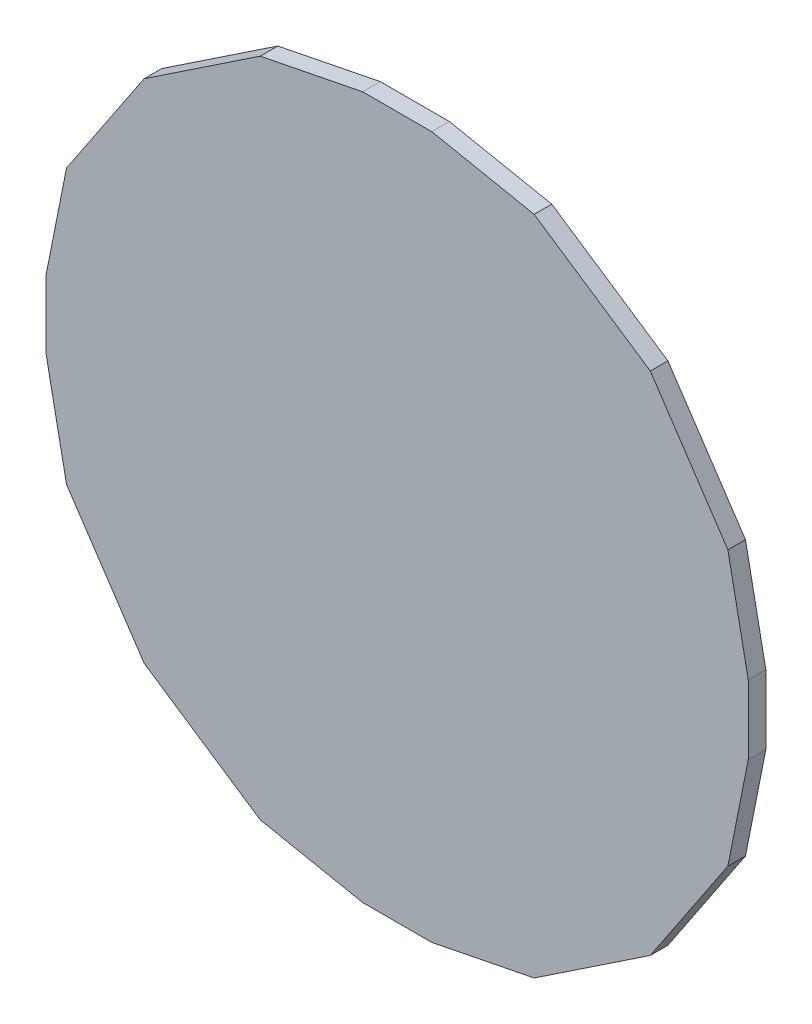
ISO-10303-21;
HEADER;
FILE_DESCRIPTION(('STEP AP214'),'2;1');
FILE_NAME('part.step','',(''),(''),'','','');
FILE_SCHEMA(('AUTOMOTIVE_DESIGN { 1 0 10303 214 1 1 1 1 }'));
ENDSEC;
DATA;
#1=APPLICATION_CONTEXT('core data for automotive mechanical design processes');
#2=APPLICATION_PROTOCOL_DEFINITION('international standard','automotive_design',2000,#1);
#3=PRODUCT_CONTEXT('',#1,'mechanical');
#4=PRODUCT('Part','Part','',(#3));
#5=PRODUCT_RELATED_PRODUCT_CATEGORY('part','',(#4));
#6=PRODUCT_DEFINITION_FORMATION('','',#4);
#7=PRODUCT_DEFINITION_CONTEXT('part definition',#1,'design');
#8=PRODUCT_DEFINITION('design','',#6,#7);
#9=PRODUCT_DEFINITION_SHAPE('','',#8);
#10=(LENGTH_UNIT() NAMED_UNIT(*) SI_UNIT(.MILLI.,.METRE.));
#11=(NAMED_UNIT(*) PLANE_ANGLE_UNIT() SI_UNIT($,.RADIAN.));
#12=(NAMED_UNIT(*) SI_UNIT($,.STERADIAN.) SOLID_ANGLE_UNIT());
#13=UNCERTAINTY_MEASURE_WITH_UNIT(LENGTH_MEASURE(1.E-05),#10,'distance_accuracy_value','');
#14=(GEOMETRIC_REPRESENTATION_CONTEXT(3) GLOBAL_UNCERTAINTY_ASSIGNED_CONTEXT((#13)) GLOBAL_UNIT_ASSIGNED_CONTEXT((#10,
#11,#12)) REPRESENTATION_CONTEXT('',''));
#15=CARTESIAN_POINT('',(0.,0.,0.));
#16=DIRECTION('',(0.,0.,1.));
#17=DIRECTION('',(1.,0.,0.));
#18=AXIS2_PLACEMENT_3D('',#15,#16,#17);
#19=CARTESIAN_POINT('',(-0.1994916,0.,0.00999998));
#20=DIRECTION('',(0.,0.,-1.));
#21=DIRECTION('',(-1.,0.,0.));
#22=AXIS2_PLACEMENT_3D('',#19,#20,#21);
#23=PLANE('',#22);
#24=DIRECTION('',(-0.195095122920935,0.980784325431675,0.));
#25=VECTOR('',#24,1.);
#26=CARTESIAN_POINT('',(-0.1994916,-0.01964943999999,0.00999998));
#27=LINE('',#26,#25);
#28=CARTESIAN_POINT('',(-0.1994916,-0.0196494399999899,0.00999998));
#29=VERTEX_POINT('',#28);
#30=CARTESIAN_POINT('',(-0.187916819999997,-0.0778382999999995,0.00999998));
#31=VERTEX_POINT('',#30);
#32=EDGE_CURVE('E239',#29,#31,#27,.F.);
#33=ORIENTED_EDGE('',*,*,#32,.T.);
#34=DIRECTION('',(-0.5555787996273,0.831463888214448,0.));
#35=VECTOR('',#34,1.);
#36=CARTESIAN_POINT('',(-0.18791682,-0.0778383,0.00999998));
#37=LINE('',#36,#35);
#38=CARTESIAN_POINT('',(-0.143824959999998,-0.143824959999999,0.00999998));
#39=VERTEX_POINT('',#38);
#40=EDGE_CURVE('E235',#31,#39,#37,.F.);
#41=ORIENTED_EDGE('',*,*,#40,.T.);
#42=DIRECTION('',(-0.831463888214757,0.555578799626838,0.));
#43=VECTOR('',#42,1.);
#44=CARTESIAN_POINT('',(-0.14382496,-0.14382496,0.00999998));
#45=LINE('',#44,#43);
#46=CARTESIAN_POINT('',(-0.0778382999999949,-0.187916819999992,0.00999998));
#47=VERTEX_POINT('',#46);
#48=EDGE_CURVE('E231',#39,#47,#45,.F.);
#49=ORIENTED_EDGE('',*,*,#48,.T.);
#50=DIRECTION('',(-0.980784325431675,0.195095122920935,0.));
#51=VECTOR('',#50,1.);
#52=CARTESIAN_POINT('',(-0.0778383,-0.18791682,0.00999998));
#53=LINE('',#52,#51);
#54=CARTESIAN_POINT('',(-0.0196494399999902,-0.199491600000003,0.00999998));
#55=VERTEX_POINT('',#54);
#56=EDGE_CURVE('E226',#47,#55,#53,.F.);
#57=ORIENTED_EDGE('',*,*,#56,.T.);
#58=DIRECTION('',(1.,0.,0.));
#59=VECTOR('',#58,1.);
#60=CARTESIAN_POINT('',(-0.01964943999999,-0.1994916,0.00999998));
#61=LINE('',#60,#59);
#62=CARTESIAN_POINT('',(0.0196494400000197,-0.1994916,0.00999998));
#63=VERTEX_POINT('',#62);
#64=EDGE_CURVE('E224',#55,#63,#61,.T.);
#65=ORIENTED_EDGE('',*,*,#64,.T.);
#66=DIRECTION('',(-0.980784325431675,-0.195095122920935,0.));
#67=VECTOR('',#66,1.);
#68=CARTESIAN_POINT('',(0.01964944000002,-0.1994916,0.00999998));
#69=LINE('',#68,#67);
#70=CARTESIAN_POINT('',(0.0778382999999997,-0.187916819999999,0.00999998));
#71=VERTEX_POINT('',#70);
#72=EDGE_CURVE('E218',#63,#71,#69,.F.);
#73=ORIENTED_EDGE('',*,*,#72,.T.);
#74=DIRECTION('',(-0.831463888214757,-0.555578799626838,0.));
#75=VECTOR('',#74,1.);
#76=CARTESIAN_POINT('',(0.0778383,-0.18791682,0.00999998));
#77=LINE('',#76,#75);
#78=CARTESIAN_POINT('',(0.143824960000005,-0.143824960000008,0.00999998));
#79=VERTEX_POINT('',#78);
#80=EDGE_CURVE('E214',#71,#79,#77,.F.);
#81=ORIENTED_EDGE('',*,*,#80,.T.);
#82=DIRECTION('',(-0.555578799626838,-0.831463888214757,0.));
#83=VECTOR('',#82,1.);
#84=CARTESIAN_POINT('',(0.14382496,-0.14382496,0.00999998));
#85=LINE('',#84,#83);
#86=CARTESIAN_POINT('',(0.187916819999992,-0.0778382999999949,0.00999998));
#87=VERTEX_POINT('',#86);
#88=EDGE_CURVE('E210',#79,#87,#85,.F.);
#89=ORIENTED_EDGE('',*,*,#88,.T.);
#90=DIRECTION('',(-0.195095122920935,-0.980784325431675,0.));
#91=VECTOR('',#90,1.);
#92=CARTESIAN_POINT('',(0.18791682,-0.0778383,0.00999998));
#93=LINE('',#92,#91);
#94=CARTESIAN_POINT('',(0.199491600000003,-0.0196494399999906,0.00999998));
#95=VERTEX_POINT('',#94);
#96=EDGE_CURVE('E205',#87,#95,#93,.F.);
#97=ORIENTED_EDGE('',*,*,#96,.T.);
#98=DIRECTION('',(0.,1.,0.));
#99=VECTOR('',#98,1.);
#100=CARTESIAN_POINT('',(0.1994916,-0.01964943999999,0.00999998));
#101=LINE('',#100,#99);
#102=CARTESIAN_POINT('',(0.1994916,0.01964943999999,0.00999998));
#103=VERTEX_POINT('',#102);
#104=EDGE_CURVE('E203',#95,#103,#101,.T.);
#105=ORIENTED_EDGE('',*,*,#104,.T.);
#106=DIRECTION('',(0.195095122920935,-0.980784325431675,0.));
#107=VECTOR('',#106,1.);
#108=CARTESIAN_POINT('',(0.1994916,0.01964943999999,0.00999998));
#109=LINE('',#108,#107);
#110=CARTESIAN_POINT('',(0.187916819999997,0.0778382999999994,0.00999998));
#111=VERTEX_POINT('',#110);
#112=EDGE_CURVE('E197',#103,#111,#109,.F.);
#113=ORIENTED_EDGE('',*,*,#112,.T.);
#114=DIRECTION('',(0.555578799626838,-0.831463888214757,0.));
#115=VECTOR('',#114,1.);
#116=CARTESIAN_POINT('',(0.18791682,0.0778383,0.00999998));
#117=LINE('',#116,#115);
#118=CARTESIAN_POINT('',(0.143824960000008,0.143824960000005,0.00999998));
#119=VERTEX_POINT('',#118);
#120=EDGE_CURVE('E193',#111,#119,#117,.F.);
#121=ORIENTED_EDGE('',*,*,#120,.T.);
#122=DIRECTION('',(0.831463888214757,-0.555578799626838,0.));
#123=VECTOR('',#122,1.);
#124=CARTESIAN_POINT('',(0.14382496,0.14382496,0.00999998));
#125=LINE('',#124,#123);
#126=CARTESIAN_POINT('',(0.0778382999999949,0.187916819999992,0.00999998));
#127=VERTEX_POINT('',#126);
#128=EDGE_CURVE('E189',#119,#127,#125,.F.);
#129=ORIENTED_EDGE('',*,*,#128,.T.);
#130=DIRECTION('',(0.980784325431675,-0.195095122920935,0.));
#131=VECTOR('',#130,1.);
#132=CARTESIAN_POINT('',(0.0778383,0.18791682,0.00999998));
#133=LINE('',#132,#131);
#134=CARTESIAN_POINT('',(0.0196494400000201,0.199491600000001,0.00999998));
#135=VERTEX_POINT('',#134);
#136=EDGE_CURVE('E184',#127,#135,#133,.F.);
#137=ORIENTED_EDGE('',*,*,#136,.T.);
#138=DIRECTION('',(1.,0.,0.));
#139=VECTOR('',#138,1.);
#140=CARTESIAN_POINT('',(0.01964944000002,0.1994916,0.00999998));
#141=LINE('',#140,#139);
#142=CARTESIAN_POINT('',(-0.0196494399999899,0.1994916,0.00999998));
#143=VERTEX_POINT('',#142);
#144=EDGE_CURVE('E182',#135,#143,#141,.F.);
#145=ORIENTED_EDGE('',*,*,#144,.T.);
#146=DIRECTION('',(0.980784325431675,0.195095122920935,0.));
#147=VECTOR('',#146,1.);
#148=CARTESIAN_POINT('',(-0.01964943999999,0.1994916,0.00999998));
#149=LINE('',#148,#147);
#150=CARTESIAN_POINT('',(-0.0778382999999995,0.187916819999997,0.00999998));
#151=VERTEX_POINT('',#150);
#152=EDGE_CURVE('E176',#143,#151,#149,.F.);
#153=ORIENTED_EDGE('',*,*,#152,.T.);
#154=DIRECTION('',(0.831463888214757,0.555578799626838,0.));
#155=VECTOR('',#154,1.);
#156=CARTESIAN_POINT('',(-0.0778383,0.18791682,0.00999998));
#157=LINE('',#156,#155);
#158=CARTESIAN_POINT('',(-0.143824960000005,0.143824960000008,0.00999998));
#159=VERTEX_POINT('',#158);
#160=EDGE_CURVE('E172',#151,#159,#157,.F.);
#161=ORIENTED_EDGE('',*,*,#160,.T.);
#162=DIRECTION('',(0.5555787996273,0.831463888214448,0.));
#163=VECTOR('',#162,1.);
#164=CARTESIAN_POINT('',(-0.14382496,0.14382496,0.00999998));
#165=LINE('',#164,#163);
#166=CARTESIAN_POINT('',(-0.187916820000002,0.077838300000001,0.00999998));
#167=VERTEX_POINT('',#166);
#168=EDGE_CURVE('E151',#159,#167,#165,.F.);
#169=ORIENTED_EDGE('',*,*,#168,.T.);
#170=DIRECTION('',(0.195095122920935,0.980784325431675,0.));
#171=VECTOR('',#170,1.);
#172=CARTESIAN_POINT('',(-0.18791682,0.0778383,0.00999998));
#173=LINE('',#172,#171);
#174=CARTESIAN_POINT('',(-0.199491600000003,0.0196494399999905,0.00999998));
#175=VERTEX_POINT('',#174);
#176=EDGE_CURVE('E20',#167,#175,#173,.F.);
#177=ORIENTED_EDGE('',*,*,#176,.T.);
#178=DIRECTION('',(0.,1.,0.));
#179=VECTOR('',#178,1.);
#180=CARTESIAN_POINT('',(-0.1994916,0.,0.00999998));
#181=LINE('',#180,#179);
#182=EDGE_CURVE('E154',#175,#29,#181,.F.);
#183=ORIENTED_EDGE('',*,*,#182,.T.);
#184=EDGE_LOOP('',(#33,#41,#49,#57,#65,#73,#81,#89,#97,#105,#113,#121,#129,#137,#145,#153,#161,
#169,#177,#183));
#185=FACE_BOUND('',#184,.T.);
#186=ADVANCED_FACE('F17',(#185),#23,.F.);
#187=CARTESIAN_POINT('',(-0.18791682,0.0778383,0.));
#188=DIRECTION('',(0.980784325431675,-0.195095122920935,0.));
#189=DIRECTION('',(0.195095122920935,0.980784325431675,0.));
#190=AXIS2_PLACEMENT_3D('',#187,#188,#189);
#191=PLANE('',#190);
#192=DIRECTION('',(0.,0.,1.));
#193=VECTOR('',#192,1.);
#194=CARTESIAN_POINT('',(-0.199491600000011,0.0196494399999922,0.));
#195=LINE('',#194,#193);
#196=CARTESIAN_POINT('',(-0.199491600000003,0.0196494399999905,0.));
#197=VERTEX_POINT('',#196);
#198=EDGE_CURVE('E157',#175,#197,#195,.F.);
#199=ORIENTED_EDGE('',*,*,#198,.F.);
#200=ORIENTED_EDGE('',*,*,#176,.F.);
#201=DIRECTION('',(0.,0.,1.));
#202=VECTOR('',#201,1.);
#203=CARTESIAN_POINT('',(-0.187916820000006,0.0778383000000042,0.));
#204=LINE('',#203,#202);
#205=CARTESIAN_POINT('',(-0.187916820000002,0.077838300000001,0.));
#206=VERTEX_POINT('',#205);
#207=EDGE_CURVE('E168',#167,#206,#204,.F.);
#208=ORIENTED_EDGE('',*,*,#207,.T.);
#209=DIRECTION('',(0.195095122920753,0.980784325431711,0.));
#210=VECTOR('',#209,1.);
#211=CARTESIAN_POINT('',(-0.1994916,0.01964943999999,0.));
#212=LINE('',#211,#210);
#213=EDGE_CURVE('E167',#197,#206,#212,.T.);
#214=ORIENTED_EDGE('',*,*,#213,.F.);
#215=EDGE_LOOP('',(#199,#200,#208,#214));
#216=FACE_BOUND('',#215,.T.);
#217=ADVANCED_FACE('F165',(#216),#191,.F.);
#218=CARTESIAN_POINT('',(-0.14382496,0.14382496,0.));
#219=DIRECTION('',(0.831463888214448,-0.5555787996273,0.));
#220=DIRECTION('',(0.5555787996273,0.831463888214448,0.));
#221=AXIS2_PLACEMENT_3D('',#218,#219,#220);
#222=PLANE('',#221);
#223=ORIENTED_EDGE('',*,*,#207,.F.);
#224=ORIENTED_EDGE('',*,*,#168,.F.);
#225=DIRECTION('',(0.,0.,1.));
#226=VECTOR('',#225,1.);
#227=CARTESIAN_POINT('',(-0.14382496000002,0.14382496000003,0.));
#228=LINE('',#227,#226);
#229=CARTESIAN_POINT('',(-0.143824960000005,0.143824960000008,0.));
#230=VERTEX_POINT('',#229);
#231=EDGE_CURVE('E174',#159,#230,#228,.F.);
#232=ORIENTED_EDGE('',*,*,#231,.T.);
#233=DIRECTION('',(0.55557879962722,0.831463888214502,0.));
#234=VECTOR('',#233,1.);
#235=CARTESIAN_POINT('',(-0.18791682,0.0778383,0.));
#236=LINE('',#235,#234);
#237=EDGE_CURVE('E245',#206,#230,#236,.T.);
#238=ORIENTED_EDGE('',*,*,#237,.F.);
#239=EDGE_LOOP('',(#223,#224,#232,#238));
#240=FACE_BOUND('',#239,.T.);
#241=ADVANCED_FACE('F379',(#240),#222,.F.);
#242=CARTESIAN_POINT('',(-0.0778383,0.18791682,0.));
#243=DIRECTION('',(0.555578799626838,-0.831463888214757,0.));
#244=DIRECTION('',(0.831463888214757,0.555578799626838,0.));
#245=AXIS2_PLACEMENT_3D('',#242,#243,#244);
#246=PLANE('',#245);
#247=ORIENTED_EDGE('',*,*,#231,.F.);
#248=ORIENTED_EDGE('',*,*,#160,.F.);
#249=DIRECTION('',(0.,0.,1.));
#250=VECTOR('',#249,1.);
#251=CARTESIAN_POINT('',(-0.0778382999999978,0.187916819999989,0.));
#252=LINE('',#251,#250);
#253=CARTESIAN_POINT('',(-0.0778382999999995,0.187916819999997,0.));
#254=VERTEX_POINT('',#253);
#255=EDGE_CURVE('E178',#151,#254,#252,.F.);
#256=ORIENTED_EDGE('',*,*,#255,.T.);
#257=DIRECTION('',(0.831463888214502,0.55557879962722,0.));
#258=VECTOR('',#257,1.);
#259=CARTESIAN_POINT('',(-0.14382496,0.14382496,0.));
#260=LINE('',#259,#258);
#261=EDGE_CURVE('E248',#230,#254,#260,.T.);
#262=ORIENTED_EDGE('',*,*,#261,.F.);
#263=EDGE_LOOP('',(#247,#248,#256,#262));
#264=FACE_BOUND('',#263,.T.);
#265=ADVANCED_FACE('F375',(#264),#246,.F.);
#266=CARTESIAN_POINT('',(-0.01964943999999,0.1994916,0.));
#267=DIRECTION('',(0.195095122920935,-0.980784325431675,0.));
#268=DIRECTION('',(0.980784325431675,0.195095122920935,0.));
#269=AXIS2_PLACEMENT_3D('',#266,#267,#268);
#270=PLANE('',#269);
#271=ORIENTED_EDGE('',*,*,#255,.F.);
#272=ORIENTED_EDGE('',*,*,#152,.F.);
#273=DIRECTION('',(0.,0.,-1.));
#274=VECTOR('',#273,1.);
#275=CARTESIAN_POINT('',(-0.01964943999999,0.1994916,0.));
#276=LINE('',#275,#274);
#277=CARTESIAN_POINT('',(-0.01964943999999,0.1994916,0.));
#278=VERTEX_POINT('',#277);
#279=EDGE_CURVE('E180',#143,#278,#276,.T.);
#280=ORIENTED_EDGE('',*,*,#279,.T.);
#281=DIRECTION('',(0.980784325431711,0.195095122920753,0.));
#282=VECTOR('',#281,1.);
#283=CARTESIAN_POINT('',(-0.0778383,0.18791682,0.));
#284=LINE('',#283,#282);
#285=EDGE_CURVE('E251',#254,#278,#284,.T.);
#286=ORIENTED_EDGE('',*,*,#285,.F.);
#287=EDGE_LOOP('',(#271,#272,#280,#286));
#288=FACE_BOUND('',#287,.T.);
#289=ADVANCED_FACE('F371',(#288),#270,.F.);
#290=CARTESIAN_POINT('',(0.01964944000002,0.1994916,0.));
#291=DIRECTION('',(0.,-1.,0.));
#292=DIRECTION('',(0.,0.,-1.));
#293=AXIS2_PLACEMENT_3D('',#290,#291,#292);
#294=PLANE('',#293);
#295=DIRECTION('',(0.,0.,1.));
#296=VECTOR('',#295,1.);
#297=CARTESIAN_POINT('',(0.019649440000021,0.199491600000005,0.));
#298=LINE('',#297,#296);
#299=CARTESIAN_POINT('',(0.0196494400000202,0.199491600000001,0.));
#300=VERTEX_POINT('',#299);
#301=EDGE_CURVE('E186',#135,#300,#298,.F.);
#302=ORIENTED_EDGE('',*,*,#301,.T.);
#303=DIRECTION('',(-1.,0.,0.));
#304=VECTOR('',#303,1.);
#305=CARTESIAN_POINT('',(-0.1994916,0.1994916,0.));
#306=LINE('',#305,#304);
#307=EDGE_CURVE('E254',#278,#300,#306,.F.);
#308=ORIENTED_EDGE('',*,*,#307,.F.);
#309=ORIENTED_EDGE('',*,*,#279,.F.);
#310=ORIENTED_EDGE('',*,*,#144,.F.);
#311=EDGE_LOOP('',(#302,#308,#309,#310));
#312=FACE_BOUND('',#311,.T.);
#313=ADVANCED_FACE('F366',(#312),#294,.F.);
#314=CARTESIAN_POINT('',(0.0778383,0.18791682,0.));
#315=DIRECTION('',(-0.195095122920935,-0.980784325431675,0.));
#316=DIRECTION('',(0.980784325431675,-0.195095122920935,0.));
#317=AXIS2_PLACEMENT_3D('',#314,#315,#316);
#318=PLANE('',#317);
#319=ORIENTED_EDGE('',*,*,#301,.F.);
#320=ORIENTED_EDGE('',*,*,#136,.F.);
#321=DIRECTION('',(0.,0.,1.));
#322=VECTOR('',#321,1.);
#323=CARTESIAN_POINT('',(0.0778382999999797,0.18791681999997,0.));
#324=LINE('',#323,#322);
#325=CARTESIAN_POINT('',(0.0778382999999949,0.187916819999992,0.));
#326=VERTEX_POINT('',#325);
#327=EDGE_CURVE('E191',#127,#326,#324,.F.);
#328=ORIENTED_EDGE('',*,*,#327,.T.);
#329=DIRECTION('',(0.980784325431692,-0.19509512292085,0.));
#330=VECTOR('',#329,1.);
#331=CARTESIAN_POINT('',(0.01964944000002,0.1994916,0.));
#332=LINE('',#331,#330);
#333=EDGE_CURVE('E256',#300,#326,#332,.T.);
#334=ORIENTED_EDGE('',*,*,#333,.F.);
#335=EDGE_LOOP('',(#319,#320,#328,#334));
#336=FACE_BOUND('',#335,.T.);
#337=ADVANCED_FACE('F361',(#336),#318,.F.);
#338=CARTESIAN_POINT('',(0.14382496,0.14382496,0.));
#339=DIRECTION('',(-0.555578799626838,-0.831463888214757,0.));
#340=DIRECTION('',(0.831463888214757,-0.555578799626838,0.));
#341=AXIS2_PLACEMENT_3D('',#338,#339,#340);
#342=PLANE('',#341);
#343=ORIENTED_EDGE('',*,*,#327,.F.);
#344=ORIENTED_EDGE('',*,*,#128,.F.);
#345=DIRECTION('',(0.,0.,1.));
#346=VECTOR('',#345,1.);
#347=CARTESIAN_POINT('',(0.14382496000003,0.14382496000002,0.));
#348=LINE('',#347,#346);
#349=CARTESIAN_POINT('',(0.143824960000008,0.143824960000005,0.));
#350=VERTEX_POINT('',#349);
#351=EDGE_CURVE('E195',#119,#350,#348,.F.);
#352=ORIENTED_EDGE('',*,*,#351,.T.);
#353=DIRECTION('',(0.831463888214502,-0.55557879962722,0.));
#354=VECTOR('',#353,1.);
#355=CARTESIAN_POINT('',(0.0778383,0.18791682,0.));
#356=LINE('',#355,#354);
#357=EDGE_CURVE('E259',#326,#350,#356,.T.);
#358=ORIENTED_EDGE('',*,*,#357,.F.);
#359=EDGE_LOOP('',(#343,#344,#352,#358));
#360=FACE_BOUND('',#359,.T.);
#361=ADVANCED_FACE('F356',(#360),#342,.F.);
#362=CARTESIAN_POINT('',(0.18791682,0.0778383,0.));
#363=DIRECTION('',(-0.831463888214757,-0.555578799626838,0.));
#364=DIRECTION('',(0.555578799626838,-0.831463888214757,0.));
#365=AXIS2_PLACEMENT_3D('',#362,#363,#364);
#366=PLANE('',#365);
#367=ORIENTED_EDGE('',*,*,#351,.F.);
#368=ORIENTED_EDGE('',*,*,#120,.F.);
#369=DIRECTION('',(0.,0.,1.));
#370=VECTOR('',#369,1.);
#371=CARTESIAN_POINT('',(0.187916819999989,0.0778382999999978,0.));
#372=LINE('',#371,#370);
#373=CARTESIAN_POINT('',(0.187916819999997,0.0778382999999994,0.));
#374=VERTEX_POINT('',#373);
#375=EDGE_CURVE('E199',#111,#374,#372,.F.);
#376=ORIENTED_EDGE('',*,*,#375,.T.);
#377=DIRECTION('',(0.55557879962722,-0.831463888214502,0.));
#378=VECTOR('',#377,1.);
#379=CARTESIAN_POINT('',(0.14382496,0.14382496,0.));
#380=LINE('',#379,#378);
#381=EDGE_CURVE('E262',#350,#374,#380,.T.);
#382=ORIENTED_EDGE('',*,*,#381,.F.);
#383=EDGE_LOOP('',(#367,#368,#376,#382));
#384=FACE_BOUND('',#383,.T.);
#385=ADVANCED_FACE('F351',(#384),#366,.F.);
#386=CARTESIAN_POINT('',(0.1994916,0.01964943999999,0.));
#387=DIRECTION('',(-0.980784325431675,-0.195095122920935,0.));
#388=DIRECTION('',(0.195095122920935,-0.980784325431675,0.));
#389=AXIS2_PLACEMENT_3D('',#386,#387,#388);
#390=PLANE('',#389);
#391=ORIENTED_EDGE('',*,*,#375,.F.);
#392=ORIENTED_EDGE('',*,*,#112,.F.);
#393=DIRECTION('',(0.,0.,1.));
#394=VECTOR('',#393,1.);
#395=CARTESIAN_POINT('',(0.1994916,0.01964943999999,0.));
#396=LINE('',#395,#394);
#397=CARTESIAN_POINT('',(0.1994916,0.01964943999999,0.));
#398=VERTEX_POINT('',#397);
#399=EDGE_CURVE('E201',#103,#398,#396,.F.);
#400=ORIENTED_EDGE('',*,*,#399,.T.);
#401=DIRECTION('',(0.195095122920753,-0.980784325431711,0.));
#402=VECTOR('',#401,1.);
#403=CARTESIAN_POINT('',(0.18791682,0.0778383,0.));
#404=LINE('',#403,#402);
#405=EDGE_CURVE('E265',#374,#398,#404,.T.);
#406=ORIENTED_EDGE('',*,*,#405,.F.);
#407=EDGE_LOOP('',(#391,#392,#400,#406));
#408=FACE_BOUND('',#407,.T.);
#409=ADVANCED_FACE('F346',(#408),#390,.F.);
#410=CARTESIAN_POINT('',(0.1994916,-0.01964943999999,0.));
#411=DIRECTION('',(-1.,0.,0.));
#412=DIRECTION('',(0.,0.,1.));
#413=AXIS2_PLACEMENT_3D('',#410,#411,#412);
#414=PLANE('',#413);
#415=DIRECTION('',(0.,0.,1.));
#416=VECTOR('',#415,1.);
#417=CARTESIAN_POINT('',(0.199491600000011,-0.0196494399999922,0.));
#418=LINE('',#417,#416);
#419=CARTESIAN_POINT('',(0.199491600000003,-0.0196494399999906,0.));
#420=VERTEX_POINT('',#419);
#421=EDGE_CURVE('E207',#95,#420,#418,.F.);
#422=ORIENTED_EDGE('',*,*,#421,.T.);
#423=DIRECTION('',(0.,1.,0.));
#424=VECTOR('',#423,1.);
#425=CARTESIAN_POINT('',(0.1994916,0.,0.));
#426=LINE('',#425,#424);
#427=EDGE_CURVE('E268',#398,#420,#426,.F.);
#428=ORIENTED_EDGE('',*,*,#427,.F.);
#429=ORIENTED_EDGE('',*,*,#399,.F.);
#430=ORIENTED_EDGE('',*,*,#104,.F.);
#431=EDGE_LOOP('',(#422,#428,#429,#430));
#432=FACE_BOUND('',#431,.T.);
#433=ADVANCED_FACE('F340',(#432),#414,.F.);
#434=CARTESIAN_POINT('',(0.18791682,-0.0778383,0.));
#435=DIRECTION('',(-0.980784325431675,0.195095122920935,0.));
#436=DIRECTION('',(-0.195095122920935,-0.980784325431675,0.));
#437=AXIS2_PLACEMENT_3D('',#434,#435,#436);
#438=PLANE('',#437);
#439=ORIENTED_EDGE('',*,*,#421,.F.);
#440=ORIENTED_EDGE('',*,*,#96,.F.);
#441=DIRECTION('',(0.,0.,1.));
#442=VECTOR('',#441,1.);
#443=CARTESIAN_POINT('',(0.18791681999997,-0.0778382999999797,0.));
#444=LINE('',#443,#442);
#445=CARTESIAN_POINT('',(0.187916819999992,-0.0778382999999949,0.));
#446=VERTEX_POINT('',#445);
#447=EDGE_CURVE('E212',#87,#446,#444,.F.);
#448=ORIENTED_EDGE('',*,*,#447,.T.);
#449=DIRECTION('',(-0.195095122920753,-0.980784325431711,0.));
#450=VECTOR('',#449,1.);
#451=CARTESIAN_POINT('',(0.1994916,-0.01964943999999,0.));
#452=LINE('',#451,#450);
#453=EDGE_CURVE('E270',#420,#446,#452,.T.);
#454=ORIENTED_EDGE('',*,*,#453,.F.);
#455=EDGE_LOOP('',(#439,#440,#448,#454));
#456=FACE_BOUND('',#455,.T.);
#457=ADVANCED_FACE('F336',(#456),#438,.F.);
#458=CARTESIAN_POINT('',(0.14382496,-0.14382496,0.));
#459=DIRECTION('',(-0.831463888214757,0.555578799626838,0.));
#460=DIRECTION('',(-0.555578799626838,-0.831463888214757,0.));
#461=AXIS2_PLACEMENT_3D('',#458,#459,#460);
#462=PLANE('',#461);
#463=ORIENTED_EDGE('',*,*,#447,.F.);
#464=ORIENTED_EDGE('',*,*,#88,.F.);
#465=DIRECTION('',(0.,0.,1.));
#466=VECTOR('',#465,1.);
#467=CARTESIAN_POINT('',(0.14382496000002,-0.14382496000003,0.));
#468=LINE('',#467,#466);
#469=CARTESIAN_POINT('',(0.143824960000005,-0.143824960000008,0.));
#470=VERTEX_POINT('',#469);
#471=EDGE_CURVE('E216',#79,#470,#468,.F.);
#472=ORIENTED_EDGE('',*,*,#471,.T.);
#473=DIRECTION('',(-0.55557879962722,-0.831463888214502,0.));
#474=VECTOR('',#473,1.);
#475=CARTESIAN_POINT('',(0.18791682,-0.0778383,0.));
#476=LINE('',#475,#474);
#477=EDGE_CURVE('E273',#446,#470,#476,.T.);
#478=ORIENTED_EDGE('',*,*,#477,.F.);
#479=EDGE_LOOP('',(#463,#464,#472,#478));
#480=FACE_BOUND('',#479,.T.);
#481=ADVANCED_FACE('F331',(#480),#462,.F.);
#482=CARTESIAN_POINT('',(0.0778383,-0.18791682,0.));
#483=DIRECTION('',(-0.555578799626838,0.831463888214757,0.));
#484=DIRECTION('',(-0.831463888214757,-0.555578799626838,0.));
#485=AXIS2_PLACEMENT_3D('',#482,#483,#484);
#486=PLANE('',#485);
#487=ORIENTED_EDGE('',*,*,#471,.F.);
#488=ORIENTED_EDGE('',*,*,#80,.F.);
#489=DIRECTION('',(0.,0.,1.));
#490=VECTOR('',#489,1.);
#491=CARTESIAN_POINT('',(0.077838299999999,-0.187916819999995,0.));
#492=LINE('',#491,#490);
#493=CARTESIAN_POINT('',(0.0778382999999997,-0.187916819999999,0.));
#494=VERTEX_POINT('',#493);
#495=EDGE_CURVE('E220',#71,#494,#492,.F.);
#496=ORIENTED_EDGE('',*,*,#495,.T.);
#497=DIRECTION('',(-0.831463888214502,-0.55557879962722,0.));
#498=VECTOR('',#497,1.);
#499=CARTESIAN_POINT('',(0.14382496,-0.14382496,0.));
#500=LINE('',#499,#498);
#501=EDGE_CURVE('E276',#470,#494,#500,.T.);
#502=ORIENTED_EDGE('',*,*,#501,.F.);
#503=EDGE_LOOP('',(#487,#488,#496,#502));
#504=FACE_BOUND('',#503,.T.);
#505=ADVANCED_FACE('F326',(#504),#486,.F.);
#506=CARTESIAN_POINT('',(0.01964944000002,-0.1994916,0.));
#507=DIRECTION('',(-0.195095122920935,0.980784325431675,0.));
#508=DIRECTION('',(-0.980784325431675,-0.195095122920935,0.));
#509=AXIS2_PLACEMENT_3D('',#506,#507,#508);
#510=PLANE('',#509);
#511=ORIENTED_EDGE('',*,*,#495,.F.);
#512=ORIENTED_EDGE('',*,*,#72,.F.);
#513=DIRECTION('',(0.,0.,1.));
#514=VECTOR('',#513,1.);
#515=CARTESIAN_POINT('',(0.01964944000002,-0.1994916,0.));
#516=LINE('',#515,#514);
#517=CARTESIAN_POINT('',(0.0196494400000199,-0.1994916,0.));
#518=VERTEX_POINT('',#517);
#519=EDGE_CURVE('E222',#63,#518,#516,.F.);
#520=ORIENTED_EDGE('',*,*,#519,.T.);
#521=DIRECTION('',(-0.980784325431692,-0.19509512292085,0.));
#522=VECTOR('',#521,1.);
#523=CARTESIAN_POINT('',(0.0778383,-0.18791682,0.));
#524=LINE('',#523,#522);
#525=EDGE_CURVE('E279',#494,#518,#524,.T.);
#526=ORIENTED_EDGE('',*,*,#525,.F.);
#527=EDGE_LOOP('',(#511,#512,#520,#526));
#528=FACE_BOUND('',#527,.T.);
#529=ADVANCED_FACE('F321',(#528),#510,.F.);
#530=CARTESIAN_POINT('',(-0.01964943999999,-0.1994916,0.));
#531=DIRECTION('',(0.,1.,0.));
#532=DIRECTION('',(0.,0.,1.));
#533=AXIS2_PLACEMENT_3D('',#530,#531,#532);
#534=PLANE('',#533);
#535=DIRECTION('',(0.,0.,1.));
#536=VECTOR('',#535,1.);
#537=CARTESIAN_POINT('',(-0.0196494399999922,-0.199491600000011,0.));
#538=LINE('',#537,#536);
#539=CARTESIAN_POINT('',(-0.0196494399999904,-0.199491600000003,0.));
#540=VERTEX_POINT('',#539);
#541=EDGE_CURVE('E228',#55,#540,#538,.F.);
#542=ORIENTED_EDGE('',*,*,#541,.T.);
#543=DIRECTION('',(-1.,0.,0.));
#544=VECTOR('',#543,1.);
#545=CARTESIAN_POINT('',(-0.1994916,-0.1994916,0.));
#546=LINE('',#545,#544);
#547=EDGE_CURVE('E282',#518,#540,#546,.T.);
#548=ORIENTED_EDGE('',*,*,#547,.F.);
#549=ORIENTED_EDGE('',*,*,#519,.F.);
#550=ORIENTED_EDGE('',*,*,#64,.F.);
#551=EDGE_LOOP('',(#542,#548,#549,#550));
#552=FACE_BOUND('',#551,.T.);
#553=ADVANCED_FACE('F316',(#552),#534,.F.);
#554=CARTESIAN_POINT('',(-0.0778383,-0.18791682,0.));
#555=DIRECTION('',(0.195095122920935,0.980784325431675,0.));
#556=DIRECTION('',(-0.980784325431675,0.195095122920935,0.));
#557=AXIS2_PLACEMENT_3D('',#554,#555,#556);
#558=PLANE('',#557);
#559=ORIENTED_EDGE('',*,*,#541,.F.);
#560=ORIENTED_EDGE('',*,*,#56,.F.);
#561=DIRECTION('',(0.,0.,1.));
#562=VECTOR('',#561,1.);
#563=CARTESIAN_POINT('',(-0.0778382999999797,-0.18791681999997,0.));
#564=LINE('',#563,#562);
#565=CARTESIAN_POINT('',(-0.0778382999999949,-0.187916819999992,0.));
#566=VERTEX_POINT('',#565);
#567=EDGE_CURVE('E233',#47,#566,#564,.F.);
#568=ORIENTED_EDGE('',*,*,#567,.T.);
#569=DIRECTION('',(-0.980784325431711,0.195095122920753,0.));
#570=VECTOR('',#569,1.);
#571=CARTESIAN_POINT('',(-0.01964943999999,-0.1994916,0.));
#572=LINE('',#571,#570);
#573=EDGE_CURVE('E284',#540,#566,#572,.T.);
#574=ORIENTED_EDGE('',*,*,#573,.F.);
#575=EDGE_LOOP('',(#559,#560,#568,#574));
#576=FACE_BOUND('',#575,.T.);
#577=ADVANCED_FACE('F311',(#576),#558,.F.);
#578=CARTESIAN_POINT('',(-0.14382496,-0.14382496,0.));
#579=DIRECTION('',(0.555578799626838,0.831463888214757,0.));
#580=DIRECTION('',(-0.831463888214757,0.555578799626838,0.));
#581=AXIS2_PLACEMENT_3D('',#578,#579,#580);
#582=PLANE('',#581);
#583=ORIENTED_EDGE('',*,*,#567,.F.);
#584=ORIENTED_EDGE('',*,*,#48,.F.);
#585=DIRECTION('',(0.,0.,1.));
#586=VECTOR('',#585,1.);
#587=CARTESIAN_POINT('',(-0.143824959999994,-0.143824959999996,0.));
#588=LINE('',#587,#586);
#589=CARTESIAN_POINT('',(-0.143824959999998,-0.143824959999999,0.));
#590=VERTEX_POINT('',#589);
#591=EDGE_CURVE('E237',#39,#590,#588,.F.);
#592=ORIENTED_EDGE('',*,*,#591,.T.);
#593=DIRECTION('',(-0.831463888214502,0.55557879962722,0.));
#594=VECTOR('',#593,1.);
#595=CARTESIAN_POINT('',(-0.0778383,-0.18791682,0.));
#596=LINE('',#595,#594);
#597=EDGE_CURVE('E287',#566,#590,#596,.T.);
#598=ORIENTED_EDGE('',*,*,#597,.F.);
#599=EDGE_LOOP('',(#583,#584,#592,#598));
#600=FACE_BOUND('',#599,.T.);
#601=ADVANCED_FACE('F307',(#600),#582,.F.);
#602=CARTESIAN_POINT('',(-0.18791682,-0.0778383,0.));
#603=DIRECTION('',(0.831463888214448,0.5555787996273,0.));
#604=DIRECTION('',(-0.5555787996273,0.831463888214448,0.));
#605=AXIS2_PLACEMENT_3D('',#602,#603,#604);
#606=PLANE('',#605);
#607=ORIENTED_EDGE('',*,*,#591,.F.);
#608=ORIENTED_EDGE('',*,*,#40,.F.);
#609=DIRECTION('',(0.,0.,1.));
#610=VECTOR('',#609,1.);
#611=CARTESIAN_POINT('',(-0.187916819999989,-0.0778382999999978,0.));
#612=LINE('',#611,#610);
#613=CARTESIAN_POINT('',(-0.187916819999997,-0.0778382999999995,0.));
#614=VERTEX_POINT('',#613);
#615=EDGE_CURVE('E161',#31,#614,#612,.F.);
#616=ORIENTED_EDGE('',*,*,#615,.T.);
#617=DIRECTION('',(-0.55557879962722,0.831463888214502,0.));
#618=VECTOR('',#617,1.);
#619=CARTESIAN_POINT('',(-0.14382496,-0.14382496,0.));
#620=LINE('',#619,#618);
#621=EDGE_CURVE('E26',#590,#614,#620,.T.);
#622=ORIENTED_EDGE('',*,*,#621,.F.);
#623=EDGE_LOOP('',(#607,#608,#616,#622));
#624=FACE_BOUND('',#623,.T.);
#625=ADVANCED_FACE('F298',(#624),#606,.F.);
#626=CARTESIAN_POINT('',(-0.1994916,-0.01964943999999,0.));
#627=DIRECTION('',(0.980784325431675,0.195095122920935,0.));
#628=DIRECTION('',(-0.195095122920935,0.980784325431675,0.));
#629=AXIS2_PLACEMENT_3D('',#626,#627,#628);
#630=PLANE('',#629);
#631=ORIENTED_EDGE('',*,*,#615,.F.);
#632=ORIENTED_EDGE('',*,*,#32,.F.);
#633=DIRECTION('',(0.,0.,-1.));
#634=VECTOR('',#633,1.);
#635=CARTESIAN_POINT('',(-0.1994916,-0.01964943999999,0.));
#636=LINE('',#635,#634);
#637=CARTESIAN_POINT('',(-0.1994916,-0.01964943999999,0.));
#638=VERTEX_POINT('',#637);
#639=EDGE_CURVE('E159',#29,#638,#636,.T.);
#640=ORIENTED_EDGE('',*,*,#639,.T.);
#641=DIRECTION('',(-0.195095122920753,0.980784325431711,0.));
#642=VECTOR('',#641,1.);
#643=CARTESIAN_POINT('',(-0.18791682,-0.0778383,0.));
#644=LINE('',#643,#642);
#645=EDGE_CURVE('E11',#614,#638,#644,.T.);
#646=ORIENTED_EDGE('',*,*,#645,.F.);
#647=EDGE_LOOP('',(#631,#632,#640,#646));
#648=FACE_BOUND('',#647,.T.);
#649=ADVANCED_FACE('F302',(#648),#630,.F.);
#650=CARTESIAN_POINT('',(-0.1994916,0.,0.));
#651=DIRECTION('',(1.,0.,0.));
#652=DIRECTION('',(0.,0.,-1.));
#653=AXIS2_PLACEMENT_3D('',#650,#651,#652);
#654=PLANE('',#653);
#655=ORIENTED_EDGE('',*,*,#639,.F.);
#656=ORIENTED_EDGE('',*,*,#182,.F.);
#657=ORIENTED_EDGE('',*,*,#198,.T.);
#658=DIRECTION('',(0.,1.,0.));
#659=VECTOR('',#658,1.);
#660=CARTESIAN_POINT('',(-0.1994916,0.,0.));
#661=LINE('',#660,#659);
#662=EDGE_CURVE('E35',#638,#197,#661,.T.);
#663=ORIENTED_EDGE('',*,*,#662,.F.);
#664=EDGE_LOOP('',(#655,#656,#657,#663));
#665=FACE_BOUND('',#664,.T.);
#666=ADVANCED_FACE('F155',(#665),#654,.F.);
#667=CARTESIAN_POINT('',(-0.1994916,0.,0.));
#668=DIRECTION('',(0.,0.,-1.));
#669=DIRECTION('',(-1.,0.,0.));
#670=AXIS2_PLACEMENT_3D('',#667,#668,#669);
#671=PLANE('',#670);
#672=ORIENTED_EDGE('',*,*,#645,.T.);
#673=ORIENTED_EDGE('',*,*,#662,.T.);
#674=ORIENTED_EDGE('',*,*,#213,.T.);
#675=ORIENTED_EDGE('',*,*,#237,.T.);
#676=ORIENTED_EDGE('',*,*,#261,.T.);
#677=ORIENTED_EDGE('',*,*,#285,.T.);
#678=ORIENTED_EDGE('',*,*,#307,.T.);
#679=ORIENTED_EDGE('',*,*,#333,.T.);
#680=ORIENTED_EDGE('',*,*,#357,.T.);
#681=ORIENTED_EDGE('',*,*,#381,.T.);
#682=ORIENTED_EDGE('',*,*,#405,.T.);
#683=ORIENTED_EDGE('',*,*,#427,.T.);
#684=ORIENTED_EDGE('',*,*,#453,.T.);
#685=ORIENTED_EDGE('',*,*,#477,.T.);
#686=ORIENTED_EDGE('',*,*,#501,.T.);
#687=ORIENTED_EDGE('',*,*,#525,.T.);
#688=ORIENTED_EDGE('',*,*,#547,.T.);
#689=ORIENTED_EDGE('',*,*,#573,.T.);
#690=ORIENTED_EDGE('',*,*,#597,.T.);
#691=ORIENTED_EDGE('',*,*,#621,.T.);
#692=EDGE_LOOP('',(#672,#673,#674,#675,#676,#677,#678,#679,#680,#681,#682,#683,#684,#685,#686,
#687,#688,#689,#690,#691));
#693=FACE_BOUND('',#692,.T.);
#694=ADVANCED_FACE('F293',(#693),#671,.T.);
#695=CLOSED_SHELL('',(#186,#217,#241,#265,#289,#313,#337,#361,#385,#409,#433,#457,#481,#505,
#529,#553,#577,#601,#625,#649,#666,#694));
#696=MANIFOLD_SOLID_BREP('B1',#695);
#697=ADVANCED_BREP_SHAPE_REPRESENTATION('',(#18,#696),#14);
#698=SHAPE_DEFINITION_REPRESENTATION(#9,#697);
ENDSEC;
END-ISO-10303-21;
